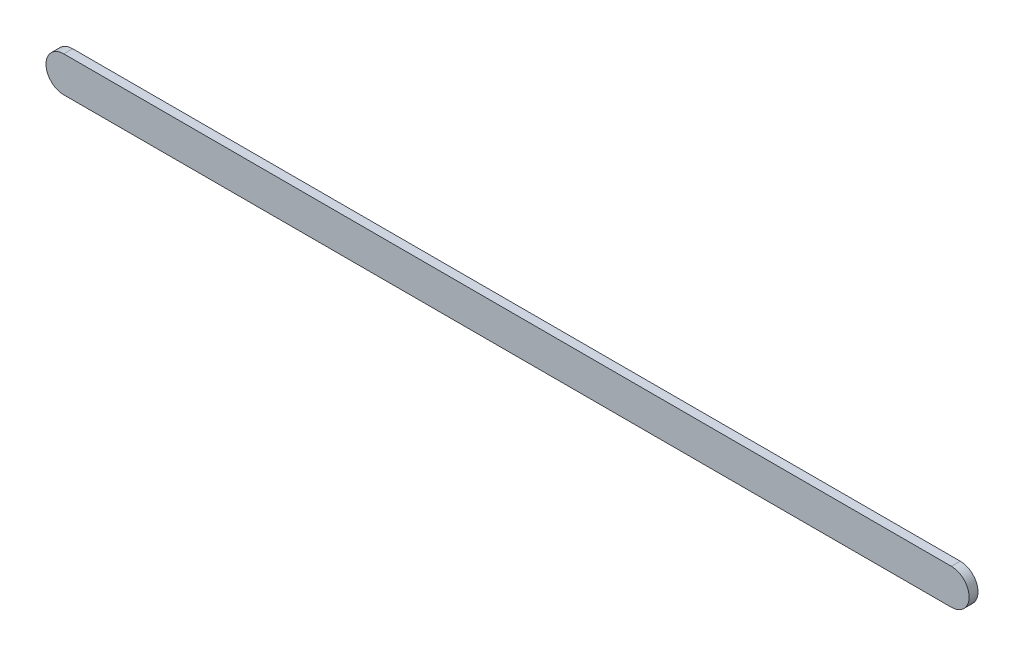
ISO-10303-21;
HEADER;
FILE_DESCRIPTION(('STEP AP214'),'2;1');
FILE_NAME('part.step','',(''),(''),'','','');
FILE_SCHEMA(('AUTOMOTIVE_DESIGN { 1 0 10303 214 1 1 1 1 }'));
ENDSEC;
DATA;
#1=APPLICATION_CONTEXT('core data for automotive mechanical design processes');
#2=APPLICATION_PROTOCOL_DEFINITION('international standard','automotive_design',2000,#1);
#3=PRODUCT_CONTEXT('',#1,'mechanical');
#4=PRODUCT('Part','Part','',(#3));
#5=PRODUCT_RELATED_PRODUCT_CATEGORY('part','',(#4));
#6=PRODUCT_DEFINITION_FORMATION('','',#4);
#7=PRODUCT_DEFINITION_CONTEXT('part definition',#1,'design');
#8=PRODUCT_DEFINITION('design','',#6,#7);
#9=PRODUCT_DEFINITION_SHAPE('','',#8);
#10=(LENGTH_UNIT() NAMED_UNIT(*) SI_UNIT(.MILLI.,.METRE.));
#11=(NAMED_UNIT(*) PLANE_ANGLE_UNIT() SI_UNIT($,.RADIAN.));
#12=(NAMED_UNIT(*) SI_UNIT($,.STERADIAN.) SOLID_ANGLE_UNIT());
#13=UNCERTAINTY_MEASURE_WITH_UNIT(LENGTH_MEASURE(1.E-05),#10,'distance_accuracy_value','');
#14=(GEOMETRIC_REPRESENTATION_CONTEXT(3) GLOBAL_UNCERTAINTY_ASSIGNED_CONTEXT((#13)) GLOBAL_UNIT_ASSIGNED_CONTEXT((#10,
#11,#12)) REPRESENTATION_CONTEXT('',''));
#15=CARTESIAN_POINT('',(0.,0.,0.));
#16=DIRECTION('',(0.,0.,1.));
#17=DIRECTION('',(1.,0.,0.));
#18=AXIS2_PLACEMENT_3D('',#15,#16,#17);
#19=CARTESIAN_POINT('',(0.,0.,2.5));
#20=DIRECTION('',(0.,0.,-1.));
#21=DIRECTION('',(-1.,0.,0.));
#22=AXIS2_PLACEMENT_3D('',#19,#20,#21);
#23=CYLINDRICAL_SURFACE('',#22,5.);
#24=CARTESIAN_POINT('',(0.,0.,0.));
#25=DIRECTION('',(0.,0.,1.));
#26=DIRECTION('',(1.,0.,0.));
#27=AXIS2_PLACEMENT_3D('',#24,#25,#26);
#28=CIRCLE('',#27,5.);
#29=CARTESIAN_POINT('',(0.,5.,0.));
#30=VERTEX_POINT('',#29);
#31=CARTESIAN_POINT('',(0.,-5.,0.));
#32=VERTEX_POINT('',#31);
#33=EDGE_CURVE('E103',#30,#32,#28,.T.);
#34=ORIENTED_EDGE('',*,*,#33,.T.);
#35=DIRECTION('',(0.,0.,-1.));
#36=VECTOR('',#35,1.);
#37=CARTESIAN_POINT('',(0.,-5.,2.5));
#38=LINE('',#37,#36);
#39=CARTESIAN_POINT('',(0.,-5.,2.5));
#40=VERTEX_POINT('',#39);
#41=EDGE_CURVE('E11',#40,#32,#38,.T.);
#42=ORIENTED_EDGE('',*,*,#41,.F.);
#43=CARTESIAN_POINT('',(0.,0.,2.5));
#44=DIRECTION('',(0.,0.,1.));
#45=DIRECTION('',(1.,0.,0.));
#46=AXIS2_PLACEMENT_3D('',#43,#44,#45);
#47=CIRCLE('',#46,5.);
#48=CARTESIAN_POINT('',(0.,5.,2.5));
#49=VERTEX_POINT('',#48);
#50=EDGE_CURVE('E91',#49,#40,#47,.T.);
#51=ORIENTED_EDGE('',*,*,#50,.F.);
#52=DIRECTION('',(0.,0.,-1.));
#53=VECTOR('',#52,1.);
#54=CARTESIAN_POINT('',(0.,5.,2.5));
#55=LINE('',#54,#53);
#56=EDGE_CURVE('E99',#49,#30,#55,.T.);
#57=ORIENTED_EDGE('',*,*,#56,.T.);
#58=EDGE_LOOP('',(#34,#42,#51,#57));
#59=FACE_BOUND('',#58,.T.);
#60=ADVANCED_FACE('F40',(#59),#23,.T.);
#61=CARTESIAN_POINT('',(0.,-5.,2.5));
#62=DIRECTION('',(0.,1.,0.));
#63=DIRECTION('',(0.,0.,1.));
#64=AXIS2_PLACEMENT_3D('',#61,#62,#63);
#65=PLANE('',#64);
#66=DIRECTION('',(1.,0.,0.));
#67=VECTOR('',#66,1.);
#68=CARTESIAN_POINT('',(0.,-5.,0.));
#69=LINE('',#68,#67);
#70=CARTESIAN_POINT('',(250.,-5.,0.));
#71=VERTEX_POINT('',#70);
#72=EDGE_CURVE('E95',#32,#71,#69,.T.);
#73=ORIENTED_EDGE('',*,*,#72,.T.);
#74=DIRECTION('',(0.,0.,-1.));
#75=VECTOR('',#74,1.);
#76=CARTESIAN_POINT('',(250.,-5.,2.5));
#77=LINE('',#76,#75);
#78=CARTESIAN_POINT('',(250.,-5.,2.5));
#79=VERTEX_POINT('',#78);
#80=EDGE_CURVE('E48',#79,#71,#77,.T.);
#81=ORIENTED_EDGE('',*,*,#80,.F.);
#82=DIRECTION('',(1.,0.,0.));
#83=VECTOR('',#82,1.);
#84=CARTESIAN_POINT('',(0.,-5.,2.5));
#85=LINE('',#84,#83);
#86=EDGE_CURVE('E86',#40,#79,#85,.T.);
#87=ORIENTED_EDGE('',*,*,#86,.F.);
#88=ORIENTED_EDGE('',*,*,#41,.T.);
#89=EDGE_LOOP('',(#73,#81,#87,#88));
#90=FACE_BOUND('',#89,.T.);
#91=ADVANCED_FACE('F94',(#90),#65,.F.);
#92=CARTESIAN_POINT('',(250.,0.,2.5));
#93=DIRECTION('',(0.,0.,-1.));
#94=DIRECTION('',(-1.,0.,0.));
#95=AXIS2_PLACEMENT_3D('',#92,#93,#94);
#96=CYLINDRICAL_SURFACE('',#95,5.);
#97=CARTESIAN_POINT('',(250.,0.,0.));
#98=DIRECTION('',(0.,0.,1.));
#99=DIRECTION('',(1.,0.,0.));
#100=AXIS2_PLACEMENT_3D('',#97,#98,#99);
#101=CIRCLE('',#100,5.);
#102=CARTESIAN_POINT('',(250.,5.,0.));
#103=VERTEX_POINT('',#102);
#104=EDGE_CURVE('E73',#71,#103,#101,.T.);
#105=ORIENTED_EDGE('',*,*,#104,.T.);
#106=DIRECTION('',(0.,0.,-1.));
#107=VECTOR('',#106,1.);
#108=CARTESIAN_POINT('',(250.,5.,2.5));
#109=LINE('',#108,#107);
#110=CARTESIAN_POINT('',(250.,5.,2.5));
#111=VERTEX_POINT('',#110);
#112=EDGE_CURVE('E96',#111,#103,#109,.T.);
#113=ORIENTED_EDGE('',*,*,#112,.F.);
#114=CARTESIAN_POINT('',(250.,0.,2.5));
#115=DIRECTION('',(0.,0.,1.));
#116=DIRECTION('',(1.,0.,0.));
#117=AXIS2_PLACEMENT_3D('',#114,#115,#116);
#118=CIRCLE('',#117,5.);
#119=EDGE_CURVE('E89',#79,#111,#118,.T.);
#120=ORIENTED_EDGE('',*,*,#119,.F.);
#121=ORIENTED_EDGE('',*,*,#80,.T.);
#122=EDGE_LOOP('',(#105,#113,#120,#121));
#123=FACE_BOUND('',#122,.T.);
#124=ADVANCED_FACE('F97',(#123),#96,.T.);
#125=CARTESIAN_POINT('',(0.,5.,2.5));
#126=DIRECTION('',(0.,-1.,0.));
#127=DIRECTION('',(0.,0.,-1.));
#128=AXIS2_PLACEMENT_3D('',#125,#126,#127);
#129=PLANE('',#128);
#130=DIRECTION('',(-1.,0.,0.));
#131=VECTOR('',#130,1.);
#132=CARTESIAN_POINT('',(0.,5.,0.));
#133=LINE('',#132,#131);
#134=EDGE_CURVE('E79',#103,#30,#133,.T.);
#135=ORIENTED_EDGE('',*,*,#134,.T.);
#136=ORIENTED_EDGE('',*,*,#56,.F.);
#137=DIRECTION('',(-1.,0.,0.));
#138=VECTOR('',#137,1.);
#139=CARTESIAN_POINT('',(0.,5.,2.5));
#140=LINE('',#139,#138);
#141=EDGE_CURVE('E56',#111,#49,#140,.T.);
#142=ORIENTED_EDGE('',*,*,#141,.F.);
#143=ORIENTED_EDGE('',*,*,#112,.T.);
#144=EDGE_LOOP('',(#135,#136,#142,#143));
#145=FACE_BOUND('',#144,.T.);
#146=ADVANCED_FACE('F110',(#145),#129,.F.);
#147=CARTESIAN_POINT('',(0.,0.,2.5));
#148=DIRECTION('',(0.,0.,1.));
#149=DIRECTION('',(1.,0.,0.));
#150=AXIS2_PLACEMENT_3D('',#147,#148,#149);
#151=PLANE('',#150);
#152=ORIENTED_EDGE('',*,*,#50,.T.);
#153=ORIENTED_EDGE('',*,*,#86,.T.);
#154=ORIENTED_EDGE('',*,*,#119,.T.);
#155=ORIENTED_EDGE('',*,*,#141,.T.);
#156=EDGE_LOOP('',(#152,#153,#154,#155));
#157=FACE_BOUND('',#156,.T.);
#158=ADVANCED_FACE('F87',(#157),#151,.T.);
#159=CARTESIAN_POINT('',(0.,0.,0.));
#160=DIRECTION('',(0.,0.,1.));
#161=DIRECTION('',(1.,0.,0.));
#162=AXIS2_PLACEMENT_3D('',#159,#160,#161);
#163=PLANE('',#162);
#164=ORIENTED_EDGE('',*,*,#33,.F.);
#165=ORIENTED_EDGE('',*,*,#134,.F.);
#166=ORIENTED_EDGE('',*,*,#104,.F.);
#167=ORIENTED_EDGE('',*,*,#72,.F.);
#168=EDGE_LOOP('',(#164,#165,#166,#167));
#169=FACE_BOUND('',#168,.T.);
#170=ADVANCED_FACE('F113',(#169),#163,.F.);
#171=CLOSED_SHELL('',(#60,#91,#124,#146,#158,#170));
#172=MANIFOLD_SOLID_BREP('B2',#171);
#173=ADVANCED_BREP_SHAPE_REPRESENTATION('',(#18,#172),#14);
#174=SHAPE_DEFINITION_REPRESENTATION(#9,#173);
ENDSEC;
END-ISO-10303-21;
